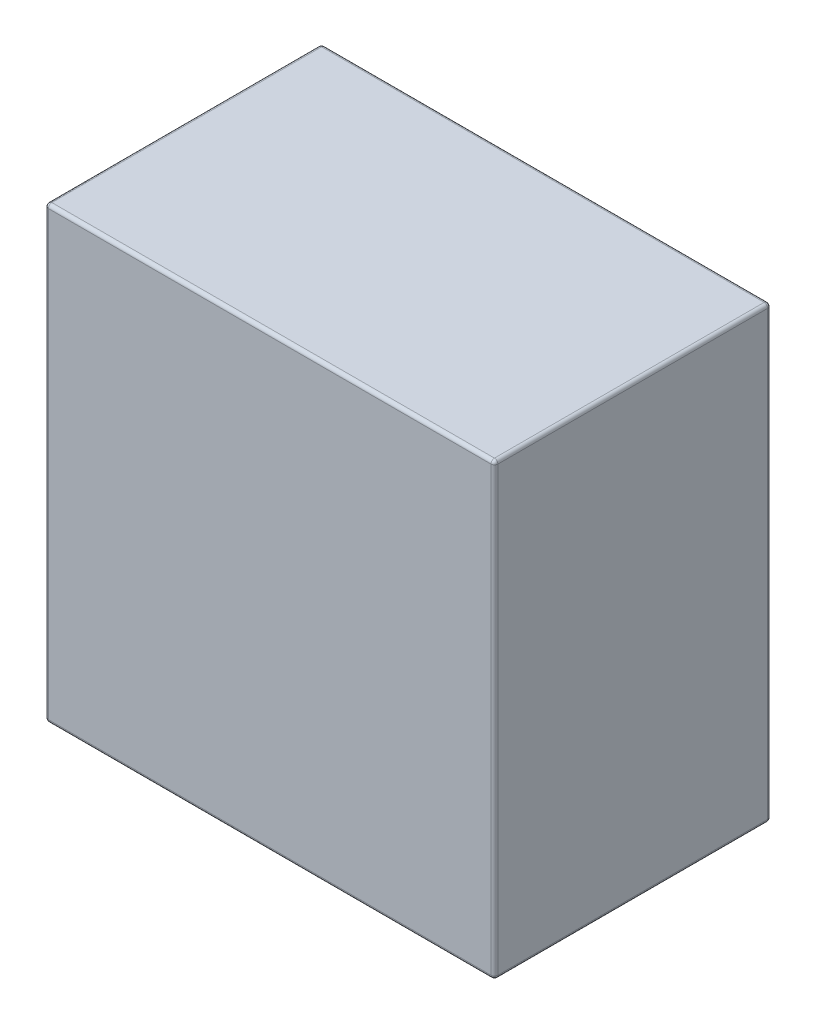
ISO-10303-21;
HEADER;
FILE_DESCRIPTION(('STEP AP214'),'2;1');
FILE_NAME('part.step','',(''),(''),'','','');
FILE_SCHEMA(('AUTOMOTIVE_DESIGN { 1 0 10303 214 1 1 1 1 }'));
ENDSEC;
DATA;
#1=APPLICATION_CONTEXT('core data for automotive mechanical design processes');
#2=APPLICATION_PROTOCOL_DEFINITION('international standard','automotive_design',2000,#1);
#3=PRODUCT_CONTEXT('',#1,'mechanical');
#4=PRODUCT('Part','Part','',(#3));
#5=PRODUCT_RELATED_PRODUCT_CATEGORY('part','',(#4));
#6=PRODUCT_DEFINITION_FORMATION('','',#4);
#7=PRODUCT_DEFINITION_CONTEXT('part definition',#1,'design');
#8=PRODUCT_DEFINITION('design','',#6,#7);
#9=PRODUCT_DEFINITION_SHAPE('','',#8);
#10=(LENGTH_UNIT() NAMED_UNIT(*) SI_UNIT(.MILLI.,.METRE.));
#11=(NAMED_UNIT(*) PLANE_ANGLE_UNIT() SI_UNIT($,.RADIAN.));
#12=(NAMED_UNIT(*) SI_UNIT($,.STERADIAN.) SOLID_ANGLE_UNIT());
#13=UNCERTAINTY_MEASURE_WITH_UNIT(LENGTH_MEASURE(1.E-05),#10,'distance_accuracy_value','');
#14=(GEOMETRIC_REPRESENTATION_CONTEXT(3) GLOBAL_UNCERTAINTY_ASSIGNED_CONTEXT((#13)) GLOBAL_UNIT_ASSIGNED_CONTEXT((#10,
#11,#12)) REPRESENTATION_CONTEXT('',''));
#15=CARTESIAN_POINT('',(0.,0.,0.));
#16=DIRECTION('',(0.,0.,1.));
#17=DIRECTION('',(1.,0.,0.));
#18=AXIS2_PLACEMENT_3D('',#15,#16,#17);
#19=CARTESIAN_POINT('',(6.5,6.5,8.));
#20=DIRECTION('',(0.,-1.,0.));
#21=DIRECTION('',(0.,0.,-1.));
#22=AXIS2_PLACEMENT_3D('',#19,#20,#21);
#23=PLANE('',#22);
#24=DIRECTION('',(0.,0.,-1.));
#25=VECTOR('',#24,1.);
#26=CARTESIAN_POINT('',(-6.4,6.5,8.));
#27=LINE('',#26,#25);
#28=CARTESIAN_POINT('',(-6.4,6.5,0.0999999999999994));
#29=VERTEX_POINT('',#28);
#30=CARTESIAN_POINT('',(-6.4,6.5,7.9));
#31=VERTEX_POINT('',#30);
#32=EDGE_CURVE('E138',#29,#31,#27,.F.);
#33=ORIENTED_EDGE('',*,*,#32,.T.);
#34=DIRECTION('',(-1.,0.,0.));
#35=VECTOR('',#34,1.);
#36=CARTESIAN_POINT('',(6.5,6.5,7.9));
#37=LINE('',#36,#35);
#38=CARTESIAN_POINT('',(6.4,6.5,7.9));
#39=VERTEX_POINT('',#38);
#40=EDGE_CURVE('E175',#31,#39,#37,.F.);
#41=ORIENTED_EDGE('',*,*,#40,.T.);
#42=DIRECTION('',(0.,0.,-1.));
#43=VECTOR('',#42,1.);
#44=CARTESIAN_POINT('',(6.4,6.5,8.));
#45=LINE('',#44,#43);
#46=CARTESIAN_POINT('',(6.4,6.5,0.0999999999999994));
#47=VERTEX_POINT('',#46);
#48=EDGE_CURVE('E172',#39,#47,#45,.T.);
#49=ORIENTED_EDGE('',*,*,#48,.T.);
#50=DIRECTION('',(-1.,0.,0.));
#51=VECTOR('',#50,1.);
#52=CARTESIAN_POINT('',(-6.5,6.5,0.0999999999999994));
#53=LINE('',#52,#51);
#54=EDGE_CURVE('E167',#47,#29,#53,.T.);
#55=ORIENTED_EDGE('',*,*,#54,.T.);
#56=EDGE_LOOP('',(#33,#41,#49,#55));
#57=FACE_BOUND('',#56,.T.);
#58=ADVANCED_FACE('F43',(#57),#23,.F.);
#59=CARTESIAN_POINT('',(-6.5,-6.5,8.));
#60=DIRECTION('',(1.,0.,0.));
#61=DIRECTION('',(0.,0.,-1.));
#62=AXIS2_PLACEMENT_3D('',#59,#60,#61);
#63=PLANE('',#62);
#64=DIRECTION('',(0.,0.,-1.));
#65=VECTOR('',#64,1.);
#66=CARTESIAN_POINT('',(-6.5,-6.4,8.));
#67=LINE('',#66,#65);
#68=CARTESIAN_POINT('',(-6.5,-6.4,0.0999999999999994));
#69=VERTEX_POINT('',#68);
#70=CARTESIAN_POINT('',(-6.5,-6.4,7.9));
#71=VERTEX_POINT('',#70);
#72=EDGE_CURVE('E160',#69,#71,#67,.F.);
#73=ORIENTED_EDGE('',*,*,#72,.T.);
#74=DIRECTION('',(0.,-1.,0.));
#75=VECTOR('',#74,1.);
#76=CARTESIAN_POINT('',(-6.5,-6.5,7.9));
#77=LINE('',#76,#75);
#78=CARTESIAN_POINT('',(-6.5,6.4,7.9));
#79=VERTEX_POINT('',#78);
#80=EDGE_CURVE('E164',#71,#79,#77,.F.);
#81=ORIENTED_EDGE('',*,*,#80,.T.);
#82=DIRECTION('',(0.,0.,-1.));
#83=VECTOR('',#82,1.);
#84=CARTESIAN_POINT('',(-6.5,6.4,8.));
#85=LINE('',#84,#83);
#86=CARTESIAN_POINT('',(-6.5,6.4,0.0999999999999994));
#87=VERTEX_POINT('',#86);
#88=EDGE_CURVE('E136',#79,#87,#85,.T.);
#89=ORIENTED_EDGE('',*,*,#88,.T.);
#90=DIRECTION('',(0.,-1.,0.));
#91=VECTOR('',#90,1.);
#92=CARTESIAN_POINT('',(-6.5,-6.5,0.0999999999999994));
#93=LINE('',#92,#91);
#94=EDGE_CURVE('E154',#87,#69,#93,.T.);
#95=ORIENTED_EDGE('',*,*,#94,.T.);
#96=EDGE_LOOP('',(#73,#81,#89,#95));
#97=FACE_BOUND('',#96,.T.);
#98=ADVANCED_FACE('F162',(#97),#63,.F.);
#99=CARTESIAN_POINT('',(6.5,-6.5,8.));
#100=DIRECTION('',(0.,1.,0.));
#101=DIRECTION('',(0.,0.,1.));
#102=AXIS2_PLACEMENT_3D('',#99,#100,#101);
#103=PLANE('',#102);
#104=DIRECTION('',(0.,0.,-1.));
#105=VECTOR('',#104,1.);
#106=CARTESIAN_POINT('',(6.4,-6.5,8.));
#107=LINE('',#106,#105);
#108=CARTESIAN_POINT('',(6.4,-6.5,0.0999999999999994));
#109=VERTEX_POINT('',#108);
#110=CARTESIAN_POINT('',(6.4,-6.5,7.9));
#111=VERTEX_POINT('',#110);
#112=EDGE_CURVE('E179',#109,#111,#107,.F.);
#113=ORIENTED_EDGE('',*,*,#112,.T.);
#114=DIRECTION('',(1.,0.,0.));
#115=VECTOR('',#114,1.);
#116=CARTESIAN_POINT('',(6.5,-6.5,7.9));
#117=LINE('',#116,#115);
#118=CARTESIAN_POINT('',(-6.4,-6.5,7.9));
#119=VERTEX_POINT('',#118);
#120=EDGE_CURVE('E184',#111,#119,#117,.F.);
#121=ORIENTED_EDGE('',*,*,#120,.T.);
#122=DIRECTION('',(0.,0.,-1.));
#123=VECTOR('',#122,1.);
#124=CARTESIAN_POINT('',(-6.4,-6.5,8.));
#125=LINE('',#124,#123);
#126=CARTESIAN_POINT('',(-6.4,-6.5,0.0999999999999994));
#127=VERTEX_POINT('',#126);
#128=EDGE_CURVE('E181',#119,#127,#125,.T.);
#129=ORIENTED_EDGE('',*,*,#128,.T.);
#130=DIRECTION('',(1.,0.,0.));
#131=VECTOR('',#130,1.);
#132=CARTESIAN_POINT('',(6.5,-6.5,0.0999999999999994));
#133=LINE('',#132,#131);
#134=EDGE_CURVE('E177',#127,#109,#133,.T.);
#135=ORIENTED_EDGE('',*,*,#134,.T.);
#136=EDGE_LOOP('',(#113,#121,#129,#135));
#137=FACE_BOUND('',#136,.T.);
#138=ADVANCED_FACE('F289',(#137),#103,.F.);
#139=CARTESIAN_POINT('',(6.5,-6.5,8.));
#140=DIRECTION('',(-1.,0.,0.));
#141=DIRECTION('',(0.,0.,1.));
#142=AXIS2_PLACEMENT_3D('',#139,#140,#141);
#143=PLANE('',#142);
#144=DIRECTION('',(0.,0.,-1.));
#145=VECTOR('',#144,1.);
#146=CARTESIAN_POINT('',(6.5,6.4,8.));
#147=LINE('',#146,#145);
#148=CARTESIAN_POINT('',(6.5,6.4,0.0999999999999994));
#149=VERTEX_POINT('',#148);
#150=CARTESIAN_POINT('',(6.5,6.4,7.9));
#151=VERTEX_POINT('',#150);
#152=EDGE_CURVE('E188',#149,#151,#147,.F.);
#153=ORIENTED_EDGE('',*,*,#152,.T.);
#154=DIRECTION('',(0.,1.,0.));
#155=VECTOR('',#154,1.);
#156=CARTESIAN_POINT('',(6.5,-6.5,7.9));
#157=LINE('',#156,#155);
#158=CARTESIAN_POINT('',(6.5,-6.4,7.9));
#159=VERTEX_POINT('',#158);
#160=EDGE_CURVE('E193',#151,#159,#157,.F.);
#161=ORIENTED_EDGE('',*,*,#160,.T.);
#162=DIRECTION('',(0.,0.,-1.));
#163=VECTOR('',#162,1.);
#164=CARTESIAN_POINT('',(6.5,-6.4,8.));
#165=LINE('',#164,#163);
#166=CARTESIAN_POINT('',(6.5,-6.4,0.0999999999999994));
#167=VERTEX_POINT('',#166);
#168=EDGE_CURVE('E190',#159,#167,#165,.T.);
#169=ORIENTED_EDGE('',*,*,#168,.T.);
#170=DIRECTION('',(0.,1.,0.));
#171=VECTOR('',#170,1.);
#172=CARTESIAN_POINT('',(6.5,6.5,0.0999999999999994));
#173=LINE('',#172,#171);
#174=EDGE_CURVE('E186',#167,#149,#173,.T.);
#175=ORIENTED_EDGE('',*,*,#174,.T.);
#176=EDGE_LOOP('',(#153,#161,#169,#175));
#177=FACE_BOUND('',#176,.T.);
#178=ADVANCED_FACE('F299',(#177),#143,.F.);
#179=CARTESIAN_POINT('',(0.,0.,8.));
#180=DIRECTION('',(0.,0.,-1.));
#181=DIRECTION('',(-1.,0.,0.));
#182=AXIS2_PLACEMENT_3D('',#179,#180,#181);
#183=PLANE('',#182);
#184=DIRECTION('',(1.,0.,0.));
#185=VECTOR('',#184,1.);
#186=CARTESIAN_POINT('',(0.,-6.4,8.));
#187=LINE('',#186,#185);
#188=CARTESIAN_POINT('',(-6.4,-6.4,8.));
#189=VERTEX_POINT('',#188);
#190=CARTESIAN_POINT('',(6.4,-6.4,8.));
#191=VERTEX_POINT('',#190);
#192=EDGE_CURVE('E199',#189,#191,#187,.T.);
#193=ORIENTED_EDGE('',*,*,#192,.T.);
#194=DIRECTION('',(0.,1.,0.));
#195=VECTOR('',#194,1.);
#196=CARTESIAN_POINT('',(6.4,0.,8.));
#197=LINE('',#196,#195);
#198=CARTESIAN_POINT('',(6.4,6.4,8.));
#199=VERTEX_POINT('',#198);
#200=EDGE_CURVE('E201',#191,#199,#197,.T.);
#201=ORIENTED_EDGE('',*,*,#200,.T.);
#202=DIRECTION('',(-1.,0.,0.));
#203=VECTOR('',#202,1.);
#204=CARTESIAN_POINT('',(0.,6.4,8.));
#205=LINE('',#204,#203);
#206=CARTESIAN_POINT('',(-6.4,6.4,8.));
#207=VERTEX_POINT('',#206);
#208=EDGE_CURVE('E195',#199,#207,#205,.T.);
#209=ORIENTED_EDGE('',*,*,#208,.T.);
#210=DIRECTION('',(0.,-1.,0.));
#211=VECTOR('',#210,1.);
#212=CARTESIAN_POINT('',(-6.4,0.,8.));
#213=LINE('',#212,#211);
#214=EDGE_CURVE('E197',#207,#189,#213,.T.);
#215=ORIENTED_EDGE('',*,*,#214,.T.);
#216=EDGE_LOOP('',(#193,#201,#209,#215));
#217=FACE_BOUND('',#216,.T.);
#218=ADVANCED_FACE('F281',(#217),#183,.F.);
#219=CARTESIAN_POINT('',(0.,0.,0.));
#220=DIRECTION('',(0.,0.,-1.));
#221=DIRECTION('',(-1.,0.,0.));
#222=AXIS2_PLACEMENT_3D('',#219,#220,#221);
#223=PLANE('',#222);
#224=DIRECTION('',(-1.,0.,0.));
#225=VECTOR('',#224,1.);
#226=CARTESIAN_POINT('',(6.5,6.4,0.));
#227=LINE('',#226,#225);
#228=CARTESIAN_POINT('',(-6.4,6.4,0.));
#229=VERTEX_POINT('',#228);
#230=CARTESIAN_POINT('',(6.4,6.4,0.));
#231=VERTEX_POINT('',#230);
#232=EDGE_CURVE('E204',#229,#231,#227,.F.);
#233=ORIENTED_EDGE('',*,*,#232,.T.);
#234=DIRECTION('',(0.,1.,0.));
#235=VECTOR('',#234,1.);
#236=CARTESIAN_POINT('',(6.4,-6.5,0.));
#237=LINE('',#236,#235);
#238=CARTESIAN_POINT('',(6.4,-6.4,0.));
#239=VERTEX_POINT('',#238);
#240=EDGE_CURVE('E11',#231,#239,#237,.F.);
#241=ORIENTED_EDGE('',*,*,#240,.T.);
#242=DIRECTION('',(1.,0.,0.));
#243=VECTOR('',#242,1.);
#244=CARTESIAN_POINT('',(-6.5,-6.4,0.));
#245=LINE('',#244,#243);
#246=CARTESIAN_POINT('',(-6.4,-6.4,0.));
#247=VERTEX_POINT('',#246);
#248=EDGE_CURVE('E52',#239,#247,#245,.F.);
#249=ORIENTED_EDGE('',*,*,#248,.T.);
#250=DIRECTION('',(0.,-1.,0.));
#251=VECTOR('',#250,1.);
#252=CARTESIAN_POINT('',(-6.4,6.5,0.));
#253=LINE('',#252,#251);
#254=EDGE_CURVE('E206',#247,#229,#253,.F.);
#255=ORIENTED_EDGE('',*,*,#254,.T.);
#256=EDGE_LOOP('',(#233,#241,#249,#255));
#257=FACE_BOUND('',#256,.T.);
#258=ADVANCED_FACE('F487',(#257),#223,.T.);
#259=CARTESIAN_POINT('',(6.4,-6.4,8.));
#260=DIRECTION('',(0.,0.,-1.));
#261=DIRECTION('',(-1.,0.,0.));
#262=AXIS2_PLACEMENT_3D('',#259,#260,#261);
#263=CYLINDRICAL_SURFACE('',#262,0.1);
#264=CARTESIAN_POINT('',(6.4,-6.4,7.9));
#265=DIRECTION('',(0.,0.,1.));
#266=DIRECTION('',(1.,0.,0.));
#267=AXIS2_PLACEMENT_3D('',#264,#265,#266);
#268=CIRCLE('',#267,0.1);
#269=EDGE_CURVE('E47',#111,#159,#268,.T.);
#270=ORIENTED_EDGE('',*,*,#269,.F.);
#271=ORIENTED_EDGE('',*,*,#112,.F.);
#272=CARTESIAN_POINT('',(6.4,-6.4,0.0999999999999994));
#273=DIRECTION('',(0.,0.,-1.));
#274=DIRECTION('',(-1.,0.,0.));
#275=AXIS2_PLACEMENT_3D('',#272,#273,#274);
#276=CIRCLE('',#275,0.1);
#277=EDGE_CURVE('E259',#167,#109,#276,.T.);
#278=ORIENTED_EDGE('',*,*,#277,.F.);
#279=ORIENTED_EDGE('',*,*,#168,.F.);
#280=EDGE_LOOP('',(#270,#271,#278,#279));
#281=FACE_BOUND('',#280,.T.);
#282=ADVANCED_FACE('F45',(#281),#263,.T.);
#283=CARTESIAN_POINT('',(6.4,-6.4,7.9));
#284=DIRECTION('',(1.,0.,0.));
#285=DIRECTION('',(0.,0.,-1.));
#286=AXIS2_PLACEMENT_3D('',#283,#284,#285);
#287=SPHERICAL_SURFACE('',#286,0.1);
#288=CARTESIAN_POINT('',(6.4,-6.4,7.9));
#289=DIRECTION('',(1.,0.,0.));
#290=DIRECTION('',(0.,0.,-1.));
#291=AXIS2_PLACEMENT_3D('',#288,#289,#290);
#292=CIRCLE('',#291,0.1);
#293=EDGE_CURVE('E254',#111,#191,#292,.F.);
#294=ORIENTED_EDGE('',*,*,#293,.F.);
#295=ORIENTED_EDGE('',*,*,#269,.T.);
#296=CARTESIAN_POINT('',(6.4,-6.4,7.9));
#297=DIRECTION('',(0.,-1.,0.));
#298=DIRECTION('',(0.,0.,-1.));
#299=AXIS2_PLACEMENT_3D('',#296,#297,#298);
#300=CIRCLE('',#299,0.1);
#301=EDGE_CURVE('E257',#191,#159,#300,.F.);
#302=ORIENTED_EDGE('',*,*,#301,.F.);
#303=EDGE_LOOP('',(#294,#295,#302));
#304=FACE_BOUND('',#303,.T.);
#305=ADVANCED_FACE('F269',(#304),#287,.T.);
#306=CARTESIAN_POINT('',(6.4,-6.4,0.1));
#307=DIRECTION('',(0.,-1.,0.));
#308=DIRECTION('',(0.,0.,-1.));
#309=AXIS2_PLACEMENT_3D('',#306,#307,#308);
#310=SPHERICAL_SURFACE('',#309,0.1);
#311=CARTESIAN_POINT('',(6.4,-6.4,0.1));
#312=DIRECTION('',(0.,-1.,0.));
#313=DIRECTION('',(0.,0.,-1.));
#314=AXIS2_PLACEMENT_3D('',#311,#312,#313);
#315=CIRCLE('',#314,0.1);
#316=EDGE_CURVE('E249',#167,#239,#315,.F.);
#317=ORIENTED_EDGE('',*,*,#316,.F.);
#318=ORIENTED_EDGE('',*,*,#277,.T.);
#319=CARTESIAN_POINT('',(6.4,-6.4,0.0999999999999994));
#320=DIRECTION('',(1.,0.,0.));
#321=DIRECTION('',(0.,0.,-1.));
#322=AXIS2_PLACEMENT_3D('',#319,#320,#321);
#323=CIRCLE('',#322,0.1);
#324=EDGE_CURVE('E252',#239,#109,#323,.F.);
#325=ORIENTED_EDGE('',*,*,#324,.F.);
#326=EDGE_LOOP('',(#317,#318,#325));
#327=FACE_BOUND('',#326,.T.);
#328=ADVANCED_FACE('F466',(#327),#310,.T.);
#329=CARTESIAN_POINT('',(6.4,0.,7.9));
#330=DIRECTION('',(0.,1.,0.));
#331=DIRECTION('',(0.,0.,1.));
#332=AXIS2_PLACEMENT_3D('',#329,#330,#331);
#333=CYLINDRICAL_SURFACE('',#332,0.1);
#334=ORIENTED_EDGE('',*,*,#301,.T.);
#335=ORIENTED_EDGE('',*,*,#160,.F.);
#336=CARTESIAN_POINT('',(6.4,6.4,7.9));
#337=DIRECTION('',(0.,1.,0.));
#338=DIRECTION('',(0.,0.,1.));
#339=AXIS2_PLACEMENT_3D('',#336,#337,#338);
#340=CIRCLE('',#339,0.1);
#341=EDGE_CURVE('E243',#199,#151,#340,.T.);
#342=ORIENTED_EDGE('',*,*,#341,.F.);
#343=ORIENTED_EDGE('',*,*,#200,.F.);
#344=EDGE_LOOP('',(#334,#335,#342,#343));
#345=FACE_BOUND('',#344,.T.);
#346=ADVANCED_FACE('F277',(#345),#333,.T.);
#347=CARTESIAN_POINT('',(0.,-6.4,7.9));
#348=DIRECTION('',(1.,0.,0.));
#349=DIRECTION('',(0.,0.,-1.));
#350=AXIS2_PLACEMENT_3D('',#347,#348,#349);
#351=CYLINDRICAL_SURFACE('',#350,0.1);
#352=ORIENTED_EDGE('',*,*,#293,.T.);
#353=ORIENTED_EDGE('',*,*,#192,.F.);
#354=CARTESIAN_POINT('',(-6.4,-6.4,7.9));
#355=DIRECTION('',(-1.,0.,0.));
#356=DIRECTION('',(0.,0.,1.));
#357=AXIS2_PLACEMENT_3D('',#354,#355,#356);
#358=CIRCLE('',#357,0.1);
#359=EDGE_CURVE('E240',#119,#189,#358,.T.);
#360=ORIENTED_EDGE('',*,*,#359,.F.);
#361=ORIENTED_EDGE('',*,*,#120,.F.);
#362=EDGE_LOOP('',(#352,#353,#360,#361));
#363=FACE_BOUND('',#362,.T.);
#364=ADVANCED_FACE('F286',(#363),#351,.T.);
#365=CARTESIAN_POINT('',(-6.4,-6.4,8.));
#366=DIRECTION('',(0.,0.,-1.));
#367=DIRECTION('',(-1.,0.,0.));
#368=AXIS2_PLACEMENT_3D('',#365,#366,#367);
#369=CYLINDRICAL_SURFACE('',#368,0.1);
#370=CARTESIAN_POINT('',(-6.4,-6.4,0.0999999999999994));
#371=DIRECTION('',(0.,0.,-1.));
#372=DIRECTION('',(-1.,0.,0.));
#373=AXIS2_PLACEMENT_3D('',#370,#371,#372);
#374=CIRCLE('',#373,0.1);
#375=EDGE_CURVE('E234',#127,#69,#374,.T.);
#376=ORIENTED_EDGE('',*,*,#375,.F.);
#377=ORIENTED_EDGE('',*,*,#128,.F.);
#378=CARTESIAN_POINT('',(-6.4,-6.4,7.9));
#379=DIRECTION('',(0.,0.,1.));
#380=DIRECTION('',(1.,0.,0.));
#381=AXIS2_PLACEMENT_3D('',#378,#379,#380);
#382=CIRCLE('',#381,0.1);
#383=EDGE_CURVE('E237',#71,#119,#382,.T.);
#384=ORIENTED_EDGE('',*,*,#383,.F.);
#385=ORIENTED_EDGE('',*,*,#72,.F.);
#386=EDGE_LOOP('',(#376,#377,#384,#385));
#387=FACE_BOUND('',#386,.T.);
#388=ADVANCED_FACE('F293',(#387),#369,.T.);
#389=CARTESIAN_POINT('',(6.5,-6.4,0.0999999999999994));
#390=DIRECTION('',(-1.,0.,0.));
#391=DIRECTION('',(0.,0.,1.));
#392=AXIS2_PLACEMENT_3D('',#389,#390,#391);
#393=CYLINDRICAL_SURFACE('',#392,0.1);
#394=ORIENTED_EDGE('',*,*,#324,.T.);
#395=ORIENTED_EDGE('',*,*,#134,.F.);
#396=CARTESIAN_POINT('',(-6.4,-6.4,0.1));
#397=DIRECTION('',(-1.,0.,0.));
#398=DIRECTION('',(0.,-1.,0.));
#399=AXIS2_PLACEMENT_3D('',#396,#397,#398);
#400=CIRCLE('',#399,0.1);
#401=EDGE_CURVE('E232',#247,#127,#400,.T.);
#402=ORIENTED_EDGE('',*,*,#401,.F.);
#403=ORIENTED_EDGE('',*,*,#248,.F.);
#404=EDGE_LOOP('',(#394,#395,#402,#403));
#405=FACE_BOUND('',#404,.T.);
#406=ADVANCED_FACE('F297',(#405),#393,.T.);
#407=CARTESIAN_POINT('',(6.4,-6.5,0.0999999999999994));
#408=DIRECTION('',(0.,-1.,0.));
#409=DIRECTION('',(0.,0.,-1.));
#410=AXIS2_PLACEMENT_3D('',#407,#408,#409);
#411=CYLINDRICAL_SURFACE('',#410,0.1);
#412=ORIENTED_EDGE('',*,*,#316,.T.);
#413=ORIENTED_EDGE('',*,*,#240,.F.);
#414=CARTESIAN_POINT('',(6.4,6.4,0.0999999999999994));
#415=DIRECTION('',(0.,1.,0.));
#416=DIRECTION('',(0.,0.,1.));
#417=AXIS2_PLACEMENT_3D('',#414,#415,#416);
#418=CIRCLE('',#417,0.1);
#419=EDGE_CURVE('E229',#149,#231,#418,.T.);
#420=ORIENTED_EDGE('',*,*,#419,.F.);
#421=ORIENTED_EDGE('',*,*,#174,.F.);
#422=EDGE_LOOP('',(#412,#413,#420,#421));
#423=FACE_BOUND('',#422,.T.);
#424=ADVANCED_FACE('F309',(#423),#411,.T.);
#425=CARTESIAN_POINT('',(6.4,6.4,8.));
#426=DIRECTION('',(0.,0.,-1.));
#427=DIRECTION('',(-1.,0.,0.));
#428=AXIS2_PLACEMENT_3D('',#425,#426,#427);
#429=CYLINDRICAL_SURFACE('',#428,0.1);
#430=CARTESIAN_POINT('',(6.4,6.4,7.9));
#431=DIRECTION('',(0.,0.,1.));
#432=DIRECTION('',(1.,0.,0.));
#433=AXIS2_PLACEMENT_3D('',#430,#431,#432);
#434=CIRCLE('',#433,0.1);
#435=EDGE_CURVE('E246',#151,#39,#434,.T.);
#436=ORIENTED_EDGE('',*,*,#435,.F.);
#437=ORIENTED_EDGE('',*,*,#152,.F.);
#438=CARTESIAN_POINT('',(6.4,6.4,0.0999999999999994));
#439=DIRECTION('',(0.,0.,-1.));
#440=DIRECTION('',(-1.,0.,0.));
#441=AXIS2_PLACEMENT_3D('',#438,#439,#440);
#442=CIRCLE('',#441,0.1);
#443=EDGE_CURVE('E226',#47,#149,#442,.T.);
#444=ORIENTED_EDGE('',*,*,#443,.F.);
#445=ORIENTED_EDGE('',*,*,#48,.F.);
#446=EDGE_LOOP('',(#436,#437,#444,#445));
#447=FACE_BOUND('',#446,.T.);
#448=ADVANCED_FACE('F304',(#447),#429,.T.);
#449=CARTESIAN_POINT('',(6.4,6.4,7.9));
#450=DIRECTION('',(1.,0.,0.));
#451=DIRECTION('',(0.,0.,-1.));
#452=AXIS2_PLACEMENT_3D('',#449,#450,#451);
#453=SPHERICAL_SURFACE('',#452,0.1);
#454=ORIENTED_EDGE('',*,*,#341,.T.);
#455=ORIENTED_EDGE('',*,*,#435,.T.);
#456=CARTESIAN_POINT('',(6.4,6.4,7.9));
#457=DIRECTION('',(1.,0.,0.));
#458=DIRECTION('',(0.,0.,-1.));
#459=AXIS2_PLACEMENT_3D('',#456,#457,#458);
#460=CIRCLE('',#459,0.1);
#461=EDGE_CURVE('E223',#199,#39,#460,.F.);
#462=ORIENTED_EDGE('',*,*,#461,.F.);
#463=EDGE_LOOP('',(#454,#455,#462));
#464=FACE_BOUND('',#463,.T.);
#465=ADVANCED_FACE('F320',(#464),#453,.T.);
#466=CARTESIAN_POINT('',(-6.4,-6.4,7.9));
#467=DIRECTION('',(0.,-1.,0.));
#468=DIRECTION('',(1.,0.,0.));
#469=AXIS2_PLACEMENT_3D('',#466,#467,#468);
#470=SPHERICAL_SURFACE('',#469,0.1);
#471=ORIENTED_EDGE('',*,*,#383,.T.);
#472=ORIENTED_EDGE('',*,*,#359,.T.);
#473=CARTESIAN_POINT('',(-6.4,-6.4,7.9));
#474=DIRECTION('',(0.,-1.,0.));
#475=DIRECTION('',(0.,0.,-1.));
#476=AXIS2_PLACEMENT_3D('',#473,#474,#475);
#477=CIRCLE('',#476,0.1);
#478=EDGE_CURVE('E220',#71,#189,#477,.F.);
#479=ORIENTED_EDGE('',*,*,#478,.F.);
#480=EDGE_LOOP('',(#471,#472,#479));
#481=FACE_BOUND('',#480,.T.);
#482=ADVANCED_FACE('F330',(#481),#470,.T.);
#483=CARTESIAN_POINT('',(-6.4,-6.4,0.1));
#484=DIRECTION('',(0.,-1.,0.));
#485=DIRECTION('',(1.,0.,0.));
#486=AXIS2_PLACEMENT_3D('',#483,#484,#485);
#487=SPHERICAL_SURFACE('',#486,0.1);
#488=ORIENTED_EDGE('',*,*,#401,.T.);
#489=ORIENTED_EDGE('',*,*,#375,.T.);
#490=CARTESIAN_POINT('',(-6.4,-6.4,0.0999999999999994));
#491=DIRECTION('',(0.,-1.,0.));
#492=DIRECTION('',(0.,0.,-1.));
#493=AXIS2_PLACEMENT_3D('',#490,#491,#492);
#494=CIRCLE('',#493,0.1);
#495=EDGE_CURVE('E157',#247,#69,#494,.F.);
#496=ORIENTED_EDGE('',*,*,#495,.F.);
#497=EDGE_LOOP('',(#488,#489,#496));
#498=FACE_BOUND('',#497,.T.);
#499=ADVANCED_FACE('F332',(#498),#487,.T.);
#500=CARTESIAN_POINT('',(6.4,6.4,0.1));
#501=DIRECTION('',(1.,0.,0.));
#502=DIRECTION('',(0.,0.,-1.));
#503=AXIS2_PLACEMENT_3D('',#500,#501,#502);
#504=SPHERICAL_SURFACE('',#503,0.1);
#505=ORIENTED_EDGE('',*,*,#443,.T.);
#506=ORIENTED_EDGE('',*,*,#419,.T.);
#507=CARTESIAN_POINT('',(6.4,6.4,0.1));
#508=DIRECTION('',(1.,0.,0.));
#509=DIRECTION('',(0.,0.,-1.));
#510=AXIS2_PLACEMENT_3D('',#507,#508,#509);
#511=CIRCLE('',#510,0.1);
#512=EDGE_CURVE('E216',#47,#231,#511,.F.);
#513=ORIENTED_EDGE('',*,*,#512,.F.);
#514=EDGE_LOOP('',(#505,#506,#513));
#515=FACE_BOUND('',#514,.T.);
#516=ADVANCED_FACE('F311',(#515),#504,.T.);
#517=CARTESIAN_POINT('',(0.,6.4,7.9));
#518=DIRECTION('',(-1.,0.,0.));
#519=DIRECTION('',(0.,0.,1.));
#520=AXIS2_PLACEMENT_3D('',#517,#518,#519);
#521=CYLINDRICAL_SURFACE('',#520,0.1);
#522=ORIENTED_EDGE('',*,*,#461,.T.);
#523=ORIENTED_EDGE('',*,*,#40,.F.);
#524=CARTESIAN_POINT('',(-6.4,6.4,7.9));
#525=DIRECTION('',(-1.,0.,0.));
#526=DIRECTION('',(0.,0.,1.));
#527=AXIS2_PLACEMENT_3D('',#524,#525,#526);
#528=CIRCLE('',#527,0.1);
#529=EDGE_CURVE('E213',#207,#31,#528,.T.);
#530=ORIENTED_EDGE('',*,*,#529,.F.);
#531=ORIENTED_EDGE('',*,*,#208,.F.);
#532=EDGE_LOOP('',(#522,#523,#530,#531));
#533=FACE_BOUND('',#532,.T.);
#534=ADVANCED_FACE('F322',(#533),#521,.T.);
#535=CARTESIAN_POINT('',(-6.4,0.,7.9));
#536=DIRECTION('',(0.,-1.,0.));
#537=DIRECTION('',(0.,0.,-1.));
#538=AXIS2_PLACEMENT_3D('',#535,#536,#537);
#539=CYLINDRICAL_SURFACE('',#538,0.1);
#540=ORIENTED_EDGE('',*,*,#478,.T.);
#541=ORIENTED_EDGE('',*,*,#214,.F.);
#542=CARTESIAN_POINT('',(-6.4,6.4,7.9));
#543=DIRECTION('',(0.,1.,0.));
#544=DIRECTION('',(0.,0.,1.));
#545=AXIS2_PLACEMENT_3D('',#542,#543,#544);
#546=CIRCLE('',#545,0.1);
#547=EDGE_CURVE('E151',#79,#207,#546,.T.);
#548=ORIENTED_EDGE('',*,*,#547,.F.);
#549=ORIENTED_EDGE('',*,*,#80,.F.);
#550=EDGE_LOOP('',(#540,#541,#548,#549));
#551=FACE_BOUND('',#550,.T.);
#552=ADVANCED_FACE('F328',(#551),#539,.T.);
#553=CARTESIAN_POINT('',(-6.4,-6.5,0.0999999999999994));
#554=DIRECTION('',(0.,1.,0.));
#555=DIRECTION('',(0.,0.,1.));
#556=AXIS2_PLACEMENT_3D('',#553,#554,#555);
#557=CYLINDRICAL_SURFACE('',#556,0.1);
#558=ORIENTED_EDGE('',*,*,#495,.T.);
#559=ORIENTED_EDGE('',*,*,#94,.F.);
#560=CARTESIAN_POINT('',(-6.4,6.4,0.1));
#561=DIRECTION('',(0.,1.,0.));
#562=DIRECTION('',(-1.,0.,0.));
#563=AXIS2_PLACEMENT_3D('',#560,#561,#562);
#564=CIRCLE('',#563,0.1);
#565=EDGE_CURVE('E144',#229,#87,#564,.T.);
#566=ORIENTED_EDGE('',*,*,#565,.F.);
#567=ORIENTED_EDGE('',*,*,#254,.F.);
#568=EDGE_LOOP('',(#558,#559,#566,#567));
#569=FACE_BOUND('',#568,.T.);
#570=ADVANCED_FACE('F155',(#569),#557,.T.);
#571=CARTESIAN_POINT('',(6.5,6.4,0.0999999999999994));
#572=DIRECTION('',(1.,0.,0.));
#573=DIRECTION('',(0.,0.,-1.));
#574=AXIS2_PLACEMENT_3D('',#571,#572,#573);
#575=CYLINDRICAL_SURFACE('',#574,0.1);
#576=ORIENTED_EDGE('',*,*,#512,.T.);
#577=ORIENTED_EDGE('',*,*,#232,.F.);
#578=CARTESIAN_POINT('',(-6.4,6.4,0.0999999999999994));
#579=DIRECTION('',(-1.,0.,0.));
#580=DIRECTION('',(0.,0.,1.));
#581=AXIS2_PLACEMENT_3D('',#578,#579,#580);
#582=CIRCLE('',#581,0.1);
#583=EDGE_CURVE('E148',#29,#229,#582,.T.);
#584=ORIENTED_EDGE('',*,*,#583,.F.);
#585=ORIENTED_EDGE('',*,*,#54,.F.);
#586=EDGE_LOOP('',(#576,#577,#584,#585));
#587=FACE_BOUND('',#586,.T.);
#588=ADVANCED_FACE('F315',(#587),#575,.T.);
#589=CARTESIAN_POINT('',(-6.4,6.4,7.9));
#590=DIRECTION('',(0.,0.,1.));
#591=DIRECTION('',(1.,0.,0.));
#592=AXIS2_PLACEMENT_3D('',#589,#590,#591);
#593=SPHERICAL_SURFACE('',#592,0.1);
#594=ORIENTED_EDGE('',*,*,#547,.T.);
#595=ORIENTED_EDGE('',*,*,#529,.T.);
#596=CARTESIAN_POINT('',(-6.4,6.4,7.9));
#597=DIRECTION('',(0.,0.,1.));
#598=DIRECTION('',(1.,0.,0.));
#599=AXIS2_PLACEMENT_3D('',#596,#597,#598);
#600=CIRCLE('',#599,0.1);
#601=EDGE_CURVE('E141',#79,#31,#600,.F.);
#602=ORIENTED_EDGE('',*,*,#601,.F.);
#603=EDGE_LOOP('',(#594,#595,#602));
#604=FACE_BOUND('',#603,.T.);
#605=ADVANCED_FACE('F326',(#604),#593,.T.);
#606=CARTESIAN_POINT('',(-6.4,6.4,0.1));
#607=DIRECTION('',(0.,0.,-1.));
#608=DIRECTION('',(-1.,0.,0.));
#609=AXIS2_PLACEMENT_3D('',#606,#607,#608);
#610=SPHERICAL_SURFACE('',#609,0.1);
#611=ORIENTED_EDGE('',*,*,#583,.T.);
#612=ORIENTED_EDGE('',*,*,#565,.T.);
#613=CARTESIAN_POINT('',(-6.4,6.4,0.0999999999999994));
#614=DIRECTION('',(0.,0.,-1.));
#615=DIRECTION('',(-1.,0.,0.));
#616=AXIS2_PLACEMENT_3D('',#613,#614,#615);
#617=CIRCLE('',#616,0.1);
#618=EDGE_CURVE('E132',#29,#87,#617,.F.);
#619=ORIENTED_EDGE('',*,*,#618,.F.);
#620=EDGE_LOOP('',(#611,#612,#619));
#621=FACE_BOUND('',#620,.T.);
#622=ADVANCED_FACE('F146',(#621),#610,.T.);
#623=CARTESIAN_POINT('',(-6.4,6.4,8.));
#624=DIRECTION('',(0.,0.,-1.));
#625=DIRECTION('',(-1.,0.,0.));
#626=AXIS2_PLACEMENT_3D('',#623,#624,#625);
#627=CYLINDRICAL_SURFACE('',#626,0.1);
#628=ORIENTED_EDGE('',*,*,#601,.T.);
#629=ORIENTED_EDGE('',*,*,#32,.F.);
#630=ORIENTED_EDGE('',*,*,#618,.T.);
#631=ORIENTED_EDGE('',*,*,#88,.F.);
#632=EDGE_LOOP('',(#628,#629,#630,#631));
#633=FACE_BOUND('',#632,.T.);
#634=ADVANCED_FACE('F134',(#633),#627,.T.);
#635=CLOSED_SHELL('',(#58,#98,#138,#178,#218,#258,#282,#305,#328,#346,#364,#388,#406,#424,#448,
#465,#482,#499,#516,#534,#552,#570,#588,#605,#622,#634));
#636=MANIFOLD_SOLID_BREP('B2',#635);
#637=ADVANCED_BREP_SHAPE_REPRESENTATION('',(#18,#636),#14);
#638=SHAPE_DEFINITION_REPRESENTATION(#9,#637);
ENDSEC;
END-ISO-10303-21;
